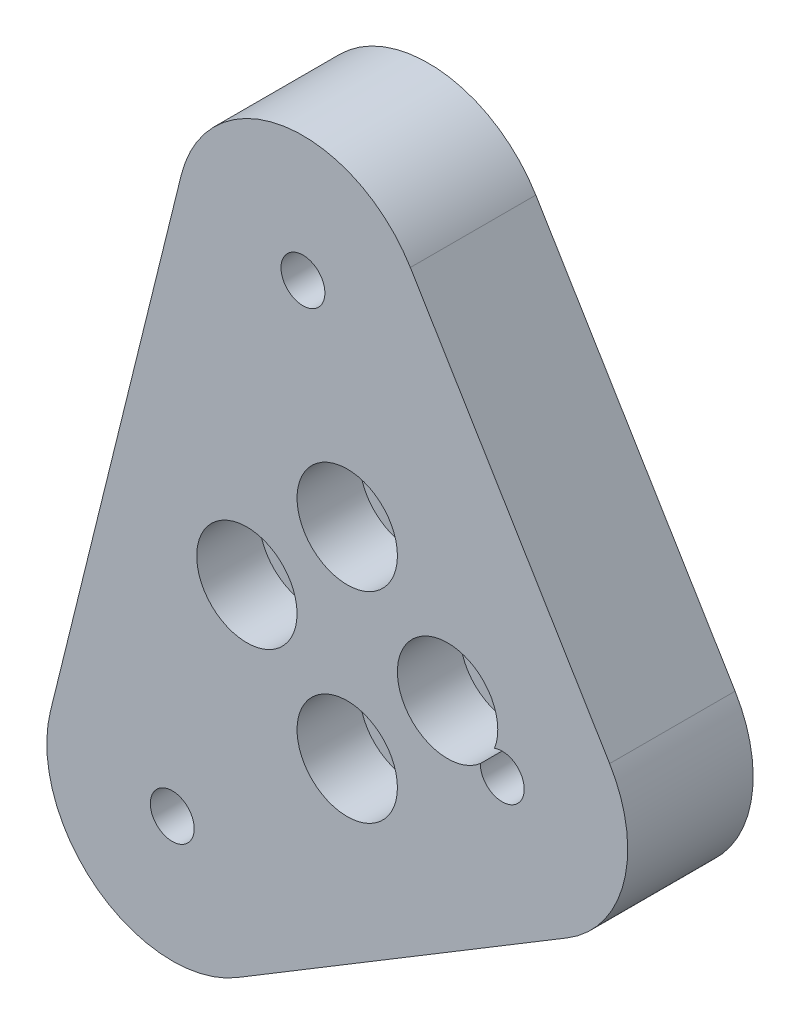
ISO-10303-21;
HEADER;
FILE_DESCRIPTION(('STEP AP214'),'2;1');
FILE_NAME('part.step','',(''),(''),'','','');
FILE_SCHEMA(('AUTOMOTIVE_DESIGN { 1 0 10303 214 1 1 1 1 }'));
ENDSEC;
DATA;
#1=APPLICATION_CONTEXT('core data for automotive mechanical design processes');
#2=APPLICATION_PROTOCOL_DEFINITION('international standard','automotive_design',2000,#1);
#3=PRODUCT_CONTEXT('',#1,'mechanical');
#4=PRODUCT('Part','Part','',(#3));
#5=PRODUCT_RELATED_PRODUCT_CATEGORY('part','',(#4));
#6=PRODUCT_DEFINITION_FORMATION('','',#4);
#7=PRODUCT_DEFINITION_CONTEXT('part definition',#1,'design');
#8=PRODUCT_DEFINITION('design','',#6,#7);
#9=PRODUCT_DEFINITION_SHAPE('','',#8);
#10=(LENGTH_UNIT() NAMED_UNIT(*) SI_UNIT(.MILLI.,.METRE.));
#11=(NAMED_UNIT(*) PLANE_ANGLE_UNIT() SI_UNIT($,.RADIAN.));
#12=(NAMED_UNIT(*) SI_UNIT($,.STERADIAN.) SOLID_ANGLE_UNIT());
#13=UNCERTAINTY_MEASURE_WITH_UNIT(LENGTH_MEASURE(1.E-05),#10,'distance_accuracy_value','');
#14=(GEOMETRIC_REPRESENTATION_CONTEXT(3) GLOBAL_UNCERTAINTY_ASSIGNED_CONTEXT((#13)) GLOBAL_UNIT_ASSIGNED_CONTEXT((#10,
#11,#12)) REPRESENTATION_CONTEXT('',''));
#15=CARTESIAN_POINT('',(0.,0.,0.));
#16=DIRECTION('',(0.,0.,1.));
#17=DIRECTION('',(1.,0.,0.));
#18=AXIS2_PLACEMENT_3D('',#15,#16,#17);
#19=CARTESIAN_POINT('',(-24.5681612260532,0.,5.));
#20=DIRECTION('',(0.,0.,1.));
#21=DIRECTION('',(1.,0.,0.));
#22=AXIS2_PLACEMENT_3D('',#19,#20,#21);
#23=PLANE('',#22);
#24=CARTESIAN_POINT('',(-8.,0.,5.));
#25=DIRECTION('',(0.,0.,1.));
#26=DIRECTION('',(1.,0.,0.));
#27=AXIS2_PLACEMENT_3D('',#24,#25,#26);
#28=CIRCLE('',#27,1.875);
#29=CARTESIAN_POINT('',(-9.875,0.,5.));
#30=VERTEX_POINT('',#29);
#31=EDGE_CURVE('E164',#30,#30,#28,.F.);
#32=ORIENTED_EDGE('',*,*,#31,.T.);
#33=EDGE_LOOP('',(#32));
#34=FACE_BOUND('',#33,.T.);
#35=CARTESIAN_POINT('',(-8.,0.,5.));
#36=DIRECTION('',(0.,0.,1.));
#37=DIRECTION('',(1.,0.,0.));
#38=AXIS2_PLACEMENT_3D('',#35,#36,#37);
#39=CIRCLE('',#38,4.);
#40=CARTESIAN_POINT('',(-4.,0.,5.));
#41=VERTEX_POINT('',#40);
#42=EDGE_CURVE('E214',#41,#41,#39,.F.);
#43=ORIENTED_EDGE('',*,*,#42,.F.);
#44=EDGE_LOOP('',(#43));
#45=FACE_BOUND('',#44,.T.);
#46=ADVANCED_FACE('F39',(#34,#45),#23,.T.);
#47=CARTESIAN_POINT('',(0.,8.,5.));
#48=DIRECTION('',(0.,0.,1.));
#49=DIRECTION('',(1.,0.,0.));
#50=AXIS2_PLACEMENT_3D('',#47,#48,#49);
#51=CIRCLE('',#50,1.875);
#52=CARTESIAN_POINT('',(-1.875,8.,5.));
#53=VERTEX_POINT('',#52);
#54=EDGE_CURVE('E159',#53,#53,#51,.F.);
#55=ORIENTED_EDGE('',*,*,#54,.T.);
#56=EDGE_LOOP('',(#55));
#57=FACE_BOUND('',#56,.T.);
#58=CARTESIAN_POINT('',(0.,8.,5.));
#59=DIRECTION('',(0.,0.,1.));
#60=DIRECTION('',(1.,0.,0.));
#61=AXIS2_PLACEMENT_3D('',#58,#59,#60);
#62=CIRCLE('',#61,4.);
#63=CARTESIAN_POINT('',(4.,8.,5.));
#64=VERTEX_POINT('',#63);
#65=EDGE_CURVE('E211',#64,#64,#62,.F.);
#66=ORIENTED_EDGE('',*,*,#65,.F.);
#67=EDGE_LOOP('',(#66));
#68=FACE_BOUND('',#67,.T.);
#69=ADVANCED_FACE('F289',(#57,#68),#23,.T.);
#70=CARTESIAN_POINT('',(12.3567981714621,-3.05115370798461,5.));
#71=DIRECTION('',(0.,0.,1.));
#72=DIRECTION('',(1.,0.,0.));
#73=AXIS2_PLACEMENT_3D('',#70,#71,#72);
#74=CIRCLE('',#73,1.75);
#75=CARTESIAN_POINT('',(11.7422659207362,-1.41260248424526,5.));
#76=VERTEX_POINT('',#75);
#77=CARTESIAN_POINT('',(10.6068838672656,-3.03383527940963,5.));
#78=VERTEX_POINT('',#77);
#79=EDGE_CURVE('E105',#76,#78,#74,.T.);
#80=ORIENTED_EDGE('',*,*,#79,.F.);
#81=CARTESIAN_POINT('',(7.99999999999989,-1.13196979001957E-13,5.));
#82=DIRECTION('',(0.,0.,1.));
#83=DIRECTION('',(1.,0.,0.));
#84=AXIS2_PLACEMENT_3D('',#81,#82,#83);
#85=CIRCLE('',#84,4.);
#86=EDGE_CURVE('E209',#78,#76,#85,.F.);
#87=ORIENTED_EDGE('',*,*,#86,.F.);
#88=EDGE_LOOP('',(#80,#87));
#89=FACE_BOUND('',#88,.T.);
#90=CARTESIAN_POINT('',(7.99999999999989,-1.13196979001957E-13,5.));
#91=DIRECTION('',(0.,0.,1.));
#92=DIRECTION('',(1.,0.,0.));
#93=AXIS2_PLACEMENT_3D('',#90,#91,#92);
#94=CIRCLE('',#93,1.87500000000022);
#95=CARTESIAN_POINT('',(6.12499999999967,-1.13196979001957E-13,5.));
#96=VERTEX_POINT('',#95);
#97=EDGE_CURVE('E153',#96,#96,#94,.F.);
#98=ORIENTED_EDGE('',*,*,#97,.T.);
#99=EDGE_LOOP('',(#98));
#100=FACE_BOUND('',#99,.T.);
#101=ADVANCED_FACE('F217',(#89,#100),#23,.T.);
#102=CARTESIAN_POINT('',(-2.24434523125278E-13,-8.,5.));
#103=DIRECTION('',(0.,0.,1.));
#104=DIRECTION('',(1.,0.,0.));
#105=AXIS2_PLACEMENT_3D('',#102,#103,#104);
#106=CIRCLE('',#105,1.87500000000027);
#107=CARTESIAN_POINT('',(-1.87500000000049,-8.,5.));
#108=VERTEX_POINT('',#107);
#109=EDGE_CURVE('E170',#108,#108,#106,.F.);
#110=ORIENTED_EDGE('',*,*,#109,.T.);
#111=EDGE_LOOP('',(#110));
#112=FACE_BOUND('',#111,.T.);
#113=CARTESIAN_POINT('',(-2.24434523125278E-13,-8.,5.));
#114=DIRECTION('',(0.,0.,1.));
#115=DIRECTION('',(1.,0.,0.));
#116=AXIS2_PLACEMENT_3D('',#113,#114,#115);
#117=CIRCLE('',#116,4.);
#118=CARTESIAN_POINT('',(3.99999999999978,-8.,5.));
#119=VERTEX_POINT('',#118);
#120=EDGE_CURVE('E206',#119,#119,#117,.F.);
#121=ORIENTED_EDGE('',*,*,#120,.F.);
#122=EDGE_LOOP('',(#121));
#123=FACE_BOUND('',#122,.T.);
#124=ADVANCED_FACE('F278',(#112,#123),#23,.T.);
#125=CARTESIAN_POINT('',(12.3567981714621,-3.05115370798461,70.));
#126=DIRECTION('',(0.,0.,-1.));
#127=DIRECTION('',(-1.,0.,0.));
#128=AXIS2_PLACEMENT_3D('',#125,#126,#127);
#129=CYLINDRICAL_SURFACE('',#128,10.);
#130=DIRECTION('',(0.,0.,-1.));
#131=VECTOR('',#130,1.);
#132=CARTESIAN_POINT('',(20.9167714378215,2.1186487717251,70.));
#133=LINE('',#132,#131);
#134=CARTESIAN_POINT('',(20.9167714378215,2.1186487717251,10.));
#135=VERTEX_POINT('',#134);
#136=CARTESIAN_POINT('',(20.9167714378215,2.1186487717251,0.));
#137=VERTEX_POINT('',#136);
#138=EDGE_CURVE('E200',#135,#137,#133,.T.);
#139=ORIENTED_EDGE('',*,*,#138,.F.);
#140=CARTESIAN_POINT('',(12.3567981714621,-3.05115370798461,10.));
#141=DIRECTION('',(0.,0.,1.));
#142=DIRECTION('',(1.,0.,0.));
#143=AXIS2_PLACEMENT_3D('',#140,#141,#142);
#144=CIRCLE('',#143,10.);
#145=CARTESIAN_POINT('',(17.526600651172,-11.6111269743439,10.));
#146=VERTEX_POINT('',#145);
#147=EDGE_CURVE('E137',#146,#135,#144,.T.);
#148=ORIENTED_EDGE('',*,*,#147,.F.);
#149=DIRECTION('',(0.,0.,-1.));
#150=VECTOR('',#149,1.);
#151=CARTESIAN_POINT('',(17.5266006511719,-11.6111269743439,70.));
#152=LINE('',#151,#150);
#153=CARTESIAN_POINT('',(17.5266006511719,-11.6111269743439,0.));
#154=VERTEX_POINT('',#153);
#155=EDGE_CURVE('E202',#146,#154,#152,.T.);
#156=ORIENTED_EDGE('',*,*,#155,.T.);
#157=CARTESIAN_POINT('',(12.3567981714621,-3.05115370798461,0.));
#158=DIRECTION('',(0.,0.,1.));
#159=DIRECTION('',(1.,0.,0.));
#160=AXIS2_PLACEMENT_3D('',#157,#158,#159);
#161=CIRCLE('',#160,10.);
#162=EDGE_CURVE('E184',#154,#137,#161,.T.);
#163=ORIENTED_EDGE('',*,*,#162,.T.);
#164=EDGE_LOOP('',(#139,#148,#156,#163));
#165=FACE_BOUND('',#164,.T.);
#166=ADVANCED_FACE('F276',(#165),#129,.T.);
#167=CARTESIAN_POINT('',(-23.6546385003536,-16.5396697222779,70.));
#168=DIRECTION('',(0.970841753421606,-0.239721275262046,0.));
#169=DIRECTION('',(0.239721275262046,0.970841753421606,0.));
#170=AXIS2_PLACEMENT_3D('',#167,#168,#169);
#171=PLANE('',#170);
#172=DIRECTION('',(0.,0.,-1.));
#173=VECTOR('',#172,1.);
#174=CARTESIAN_POINT('',(-23.6546385003536,-16.5396697222779,70.));
#175=LINE('',#174,#173);
#176=CARTESIAN_POINT('',(-23.6546385003536,-16.5396697222779,10.));
#177=VERTEX_POINT('',#176);
#178=CARTESIAN_POINT('',(-23.6546385003536,-16.5396697222779,0.));
#179=VERTEX_POINT('',#178);
#180=EDGE_CURVE('E61',#177,#179,#175,.T.);
#181=ORIENTED_EDGE('',*,*,#180,.F.);
#182=DIRECTION('',(-0.239721275262046,-0.970841753421606,0.));
#183=VECTOR('',#182,1.);
#184=CARTESIAN_POINT('',(-13.2373481296674,25.6490781822357,10.));
#185=LINE('',#184,#183);
#186=CARTESIAN_POINT('',(-13.2373481296674,25.6490781822357,10.));
#187=VERTEX_POINT('',#186);
#188=EDGE_CURVE('E146',#187,#177,#185,.T.);
#189=ORIENTED_EDGE('',*,*,#188,.F.);
#190=DIRECTION('',(0.,0.,-1.));
#191=VECTOR('',#190,1.);
#192=CARTESIAN_POINT('',(-13.2373481296674,25.6490781822357,70.));
#193=LINE('',#192,#191);
#194=CARTESIAN_POINT('',(-13.2373481296674,25.6490781822357,0.));
#195=VERTEX_POINT('',#194);
#196=EDGE_CURVE('E196',#187,#195,#193,.T.);
#197=ORIENTED_EDGE('',*,*,#196,.T.);
#198=DIRECTION('',(-0.239721275262046,-0.970841753421606,0.));
#199=VECTOR('',#198,1.);
#200=CARTESIAN_POINT('',(-23.6546385003536,-16.5396697222779,0.));
#201=LINE('',#200,#199);
#202=EDGE_CURVE('E193',#195,#179,#201,.T.);
#203=ORIENTED_EDGE('',*,*,#202,.T.);
#204=EDGE_LOOP('',(#181,#189,#197,#203));
#205=FACE_BOUND('',#204,.T.);
#206=ADVANCED_FACE('F239',(#205),#171,.F.);
#207=CARTESIAN_POINT('',(-13.9462209661375,-18.9368824748984,0.));
#208=DIRECTION('',(0.,0.,1.));
#209=DIRECTION('',(1.,0.,0.));
#210=AXIS2_PLACEMENT_3D('',#207,#208,#209);
#211=PLANE('',#210);
#212=CARTESIAN_POINT('',(-3.52893059545137,23.2518654296152,0.));
#213=DIRECTION('',(0.,0.,-1.));
#214=DIRECTION('',(-1.,0.,0.));
#215=AXIS2_PLACEMENT_3D('',#212,#213,#214);
#216=CIRCLE('',#215,1.75);
#217=CARTESIAN_POINT('',(-5.27893059545137,23.2518654296152,0.));
#218=VERTEX_POINT('',#217);
#219=EDGE_CURVE('E221',#218,#218,#216,.T.);
#220=ORIENTED_EDGE('',*,*,#219,.F.);
#221=EDGE_LOOP('',(#220));
#222=FACE_BOUND('',#221,.T.);
#223=CARTESIAN_POINT('',(12.3567981714621,-3.05115370798461,0.));
#224=DIRECTION('',(0.,0.,-1.));
#225=DIRECTION('',(-1.,0.,0.));
#226=AXIS2_PLACEMENT_3D('',#223,#224,#225);
#227=CIRCLE('',#226,1.75);
#228=CARTESIAN_POINT('',(10.6067981714621,-3.05115370798461,0.));
#229=VERTEX_POINT('',#228);
#230=EDGE_CURVE('E115',#229,#229,#227,.T.);
#231=ORIENTED_EDGE('',*,*,#230,.F.);
#232=EDGE_LOOP('',(#231));
#233=FACE_BOUND('',#232,.T.);
#234=CARTESIAN_POINT('',(-13.9462209661375,-18.9368824748984,0.));
#235=DIRECTION('',(0.,0.,-1.));
#236=DIRECTION('',(-1.,0.,0.));
#237=AXIS2_PLACEMENT_3D('',#234,#235,#236);
#238=CIRCLE('',#237,1.75);
#239=CARTESIAN_POINT('',(-15.6962209661375,-18.9368824748984,0.));
#240=VERTEX_POINT('',#239);
#241=EDGE_CURVE('E116',#240,#240,#238,.T.);
#242=ORIENTED_EDGE('',*,*,#241,.F.);
#243=EDGE_LOOP('',(#242));
#244=FACE_BOUND('',#243,.T.);
#245=CARTESIAN_POINT('',(0.,0.,0.));
#246=DIRECTION('',(0.,0.,-1.));
#247=DIRECTION('',(-1.,0.,0.));
#248=AXIS2_PLACEMENT_3D('',#245,#246,#247);
#249=CIRCLE('',#248,4.);
#250=CARTESIAN_POINT('',(-4.,0.,0.));
#251=VERTEX_POINT('',#250);
#252=EDGE_CURVE('E149',#251,#251,#249,.T.);
#253=ORIENTED_EDGE('',*,*,#252,.F.);
#254=EDGE_LOOP('',(#253));
#255=FACE_BOUND('',#254,.T.);
#256=CARTESIAN_POINT('',(0.,8.,0.));
#257=DIRECTION('',(0.,0.,-1.));
#258=DIRECTION('',(-1.,0.,0.));
#259=AXIS2_PLACEMENT_3D('',#256,#257,#258);
#260=CIRCLE('',#259,1.875);
#261=CARTESIAN_POINT('',(-1.875,8.,0.));
#262=VERTEX_POINT('',#261);
#263=EDGE_CURVE('E156',#262,#262,#260,.T.);
#264=ORIENTED_EDGE('',*,*,#263,.F.);
#265=EDGE_LOOP('',(#264));
#266=FACE_BOUND('',#265,.T.);
#267=CARTESIAN_POINT('',(-8.,0.,0.));
#268=DIRECTION('',(0.,0.,-1.));
#269=DIRECTION('',(-1.,0.,0.));
#270=AXIS2_PLACEMENT_3D('',#267,#268,#269);
#271=CIRCLE('',#270,1.875);
#272=CARTESIAN_POINT('',(-9.875,0.,0.));
#273=VERTEX_POINT('',#272);
#274=EDGE_CURVE('E160',#273,#273,#271,.T.);
#275=ORIENTED_EDGE('',*,*,#274,.F.);
#276=EDGE_LOOP('',(#275));
#277=FACE_BOUND('',#276,.T.);
#278=CARTESIAN_POINT('',(-2.24434523125278E-13,-8.,0.));
#279=DIRECTION('',(0.,0.,-1.));
#280=DIRECTION('',(-1.,0.,0.));
#281=AXIS2_PLACEMENT_3D('',#278,#279,#280);
#282=CIRCLE('',#281,1.87500000000027);
#283=CARTESIAN_POINT('',(-1.87500000000049,-8.,0.));
#284=VERTEX_POINT('',#283);
#285=EDGE_CURVE('E167',#284,#284,#282,.T.);
#286=ORIENTED_EDGE('',*,*,#285,.F.);
#287=EDGE_LOOP('',(#286));
#288=FACE_BOUND('',#287,.T.);
#289=CARTESIAN_POINT('',(7.99999999999989,-1.13196979001957E-13,0.));
#290=DIRECTION('',(0.,0.,-1.));
#291=DIRECTION('',(-1.,0.,0.));
#292=AXIS2_PLACEMENT_3D('',#289,#290,#291);
#293=CIRCLE('',#292,1.87500000000022);
#294=CARTESIAN_POINT('',(6.12499999999967,-1.13196979001957E-13,0.));
#295=VERTEX_POINT('',#294);
#296=EDGE_CURVE('E173',#295,#295,#293,.T.);
#297=ORIENTED_EDGE('',*,*,#296,.F.);
#298=EDGE_LOOP('',(#297));
#299=FACE_BOUND('',#298,.T.);
#300=CARTESIAN_POINT('',(-13.9462209661375,-18.9368824748984,0.));
#301=DIRECTION('',(0.,0.,1.));
#302=DIRECTION('',(1.,0.,0.));
#303=AXIS2_PLACEMENT_3D('',#300,#301,#302);
#304=CIRCLE('',#303,10.);
#305=CARTESIAN_POINT('',(-8.77641848642773,-27.4968557412577,0.));
#306=VERTEX_POINT('',#305);
#307=EDGE_CURVE('E163',#179,#306,#304,.T.);
#308=ORIENTED_EDGE('',*,*,#307,.F.);
#309=ORIENTED_EDGE('',*,*,#202,.F.);
#310=CARTESIAN_POINT('',(-3.52893059545137,23.2518654296152,0.));
#311=DIRECTION('',(0.,0.,1.));
#312=DIRECTION('',(1.,0.,0.));
#313=AXIS2_PLACEMENT_3D('',#310,#311,#312);
#314=CIRCLE('',#313,10.);
#315=CARTESIAN_POINT('',(5.03104267090801,28.4216679093249,0.));
#316=VERTEX_POINT('',#315);
#317=EDGE_CURVE('E190',#316,#195,#314,.T.);
#318=ORIENTED_EDGE('',*,*,#317,.F.);
#319=DIRECTION('',(-0.516980247970972,0.855997326635938,0.));
#320=VECTOR('',#319,1.);
#321=CARTESIAN_POINT('',(5.03104267090801,28.4216679093249,0.));
#322=LINE('',#321,#320);
#323=EDGE_CURVE('E187',#137,#316,#322,.T.);
#324=ORIENTED_EDGE('',*,*,#323,.F.);
#325=ORIENTED_EDGE('',*,*,#162,.F.);
#326=DIRECTION('',(0.855997326635932,0.516980247970981,0.));
#327=VECTOR('',#326,1.);
#328=CARTESIAN_POINT('',(17.526600651172,-11.6111269743439,0.));
#329=LINE('',#328,#327);
#330=EDGE_CURVE('E181',#306,#154,#329,.T.);
#331=ORIENTED_EDGE('',*,*,#330,.F.);
#332=EDGE_LOOP('',(#308,#309,#318,#324,#325,#331));
#333=FACE_BOUND('',#332,.T.);
#334=ADVANCED_FACE('F236',(#222,#233,#244,#255,#266,#277,#288,#299,#333),#211,.F.);
#335=CARTESIAN_POINT('',(-13.9462209661375,-18.9368824748984,70.));
#336=DIRECTION('',(0.,0.,-1.));
#337=DIRECTION('',(-1.,0.,0.));
#338=AXIS2_PLACEMENT_3D('',#335,#336,#337);
#339=CYLINDRICAL_SURFACE('',#338,10.);
#340=DIRECTION('',(0.,0.,-1.));
#341=VECTOR('',#340,1.);
#342=CARTESIAN_POINT('',(-8.77641848642773,-27.4968557412577,70.));
#343=LINE('',#342,#341);
#344=CARTESIAN_POINT('',(-8.77641848642773,-27.4968557412577,10.));
#345=VERTEX_POINT('',#344);
#346=EDGE_CURVE('E204',#345,#306,#343,.T.);
#347=ORIENTED_EDGE('',*,*,#346,.F.);
#348=CARTESIAN_POINT('',(-13.9462209661375,-18.9368824748984,10.));
#349=DIRECTION('',(0.,0.,1.));
#350=DIRECTION('',(1.,0.,0.));
#351=AXIS2_PLACEMENT_3D('',#348,#349,#350);
#352=CIRCLE('',#351,10.);
#353=EDGE_CURVE('E131',#177,#345,#352,.T.);
#354=ORIENTED_EDGE('',*,*,#353,.F.);
#355=ORIENTED_EDGE('',*,*,#180,.T.);
#356=ORIENTED_EDGE('',*,*,#307,.T.);
#357=EDGE_LOOP('',(#347,#354,#355,#356));
#358=FACE_BOUND('',#357,.T.);
#359=ADVANCED_FACE('F41',(#358),#339,.T.);
#360=CARTESIAN_POINT('',(17.526600651172,-11.6111269743439,70.));
#361=DIRECTION('',(-0.516980247970981,0.855997326635932,0.));
#362=DIRECTION('',(-0.855997326635932,-0.516980247970981,0.));
#363=AXIS2_PLACEMENT_3D('',#360,#361,#362);
#364=PLANE('',#363);
#365=ORIENTED_EDGE('',*,*,#155,.F.);
#366=DIRECTION('',(0.855997326635932,0.516980247970981,0.));
#367=VECTOR('',#366,1.);
#368=CARTESIAN_POINT('',(-8.77641848642773,-27.4968557412577,10.));
#369=LINE('',#368,#367);
#370=EDGE_CURVE('E134',#345,#146,#369,.T.);
#371=ORIENTED_EDGE('',*,*,#370,.F.);
#372=ORIENTED_EDGE('',*,*,#346,.T.);
#373=ORIENTED_EDGE('',*,*,#330,.T.);
#374=EDGE_LOOP('',(#365,#371,#372,#373));
#375=FACE_BOUND('',#374,.T.);
#376=ADVANCED_FACE('F262',(#375),#364,.F.);
#377=CARTESIAN_POINT('',(5.03104267090801,28.4216679093249,70.));
#378=DIRECTION('',(-0.855997326635938,-0.516980247970972,0.));
#379=DIRECTION('',(0.516980247970972,-0.855997326635938,0.));
#380=AXIS2_PLACEMENT_3D('',#377,#378,#379);
#381=PLANE('',#380);
#382=DIRECTION('',(0.,0.,-1.));
#383=VECTOR('',#382,1.);
#384=CARTESIAN_POINT('',(5.03104267090801,28.4216679093249,70.));
#385=LINE('',#384,#383);
#386=CARTESIAN_POINT('',(5.03104267090801,28.4216679093249,10.));
#387=VERTEX_POINT('',#386);
#388=EDGE_CURVE('E198',#387,#316,#385,.T.);
#389=ORIENTED_EDGE('',*,*,#388,.F.);
#390=DIRECTION('',(-0.516980247970972,0.855997326635938,0.));
#391=VECTOR('',#390,1.);
#392=CARTESIAN_POINT('',(20.9167714378215,2.1186487717251,10.));
#393=LINE('',#392,#391);
#394=EDGE_CURVE('E140',#135,#387,#393,.T.);
#395=ORIENTED_EDGE('',*,*,#394,.F.);
#396=ORIENTED_EDGE('',*,*,#138,.T.);
#397=ORIENTED_EDGE('',*,*,#323,.T.);
#398=EDGE_LOOP('',(#389,#395,#396,#397));
#399=FACE_BOUND('',#398,.T.);
#400=ADVANCED_FACE('F273',(#399),#381,.F.);
#401=CARTESIAN_POINT('',(-3.52893059545137,23.2518654296152,70.));
#402=DIRECTION('',(0.,0.,-1.));
#403=DIRECTION('',(-1.,0.,0.));
#404=AXIS2_PLACEMENT_3D('',#401,#402,#403);
#405=CYLINDRICAL_SURFACE('',#404,10.);
#406=ORIENTED_EDGE('',*,*,#196,.F.);
#407=CARTESIAN_POINT('',(-3.52893059545137,23.2518654296152,10.));
#408=DIRECTION('',(0.,0.,1.));
#409=DIRECTION('',(1.,0.,0.));
#410=AXIS2_PLACEMENT_3D('',#407,#408,#409);
#411=CIRCLE('',#410,10.);
#412=EDGE_CURVE('E143',#387,#187,#411,.T.);
#413=ORIENTED_EDGE('',*,*,#412,.F.);
#414=ORIENTED_EDGE('',*,*,#388,.T.);
#415=ORIENTED_EDGE('',*,*,#317,.T.);
#416=EDGE_LOOP('',(#406,#413,#414,#415));
#417=FACE_BOUND('',#416,.T.);
#418=ADVANCED_FACE('F270',(#417),#405,.T.);
#419=CARTESIAN_POINT('',(7.99999999999989,-1.13196979001957E-13,10.3033008588999));
#420=DIRECTION('',(0.,0.,-1.));
#421=DIRECTION('',(-1.,0.,0.));
#422=AXIS2_PLACEMENT_3D('',#419,#420,#421);
#423=CYLINDRICAL_SURFACE('',#422,1.87500000000022);
#424=CARTESIAN_POINT('',(6.12499999999967,-1.13196979001957E-13,0.));
#425=CARTESIAN_POINT('',(6.12499999999967,-1.13196979001957E-13,0.0520833333333334));
#426=CARTESIAN_POINT('',(6.12499999999967,-1.13196979001957E-13,0.104166666666667));
#427=CARTESIAN_POINT('',(6.12499999999967,-1.13196979001957E-13,0.208333333333334));
#428=CARTESIAN_POINT('',(6.12499999999967,-1.13196979001957E-13,0.260416666666667));
#429=CARTESIAN_POINT('',(6.12499999999967,-1.13196979001957E-13,0.364583333333334));
#430=CARTESIAN_POINT('',(6.12499999999967,-1.13196979001957E-13,0.416666666666667));
#431=CARTESIAN_POINT('',(6.12499999999967,-1.13196979001957E-13,0.520833333333334));
#432=CARTESIAN_POINT('',(6.12499999999967,-1.13196979001957E-13,0.572916666666667));
#433=CARTESIAN_POINT('',(6.12499999999967,-1.13196979001957E-13,0.677083333333334));
#434=CARTESIAN_POINT('',(6.12499999999967,-1.13196979001957E-13,0.729166666666667));
#435=CARTESIAN_POINT('',(6.12499999999967,-1.13196979001957E-13,0.833333333333333));
#436=CARTESIAN_POINT('',(6.12499999999967,-1.13196979001957E-13,0.885416666666666));
#437=CARTESIAN_POINT('',(6.12499999999967,-1.13196979001957E-13,0.989583333333333));
#438=CARTESIAN_POINT('',(6.12499999999967,-1.13196979001957E-13,1.04166666666667));
#439=CARTESIAN_POINT('',(6.12499999999967,-1.13196979001957E-13,1.14583333333333));
#440=CARTESIAN_POINT('',(6.12499999999967,-1.13196979001957E-13,1.19791666666667));
#441=CARTESIAN_POINT('',(6.12499999999967,-1.13196979001957E-13,1.30208333333333));
#442=CARTESIAN_POINT('',(6.12499999999967,-1.13196979001957E-13,1.35416666666667));
#443=CARTESIAN_POINT('',(6.12499999999967,-1.13196979001957E-13,1.45833333333333));
#444=CARTESIAN_POINT('',(6.12499999999967,-1.13196979001957E-13,1.51041666666667));
#445=CARTESIAN_POINT('',(6.12499999999967,-1.13196979001957E-13,1.61458333333333));
#446=CARTESIAN_POINT('',(6.12499999999967,-1.13196979001957E-13,1.66666666666667));
#447=CARTESIAN_POINT('',(6.12499999999967,-1.13196979001957E-13,1.77083333333333));
#448=CARTESIAN_POINT('',(6.12499999999967,-1.13196979001957E-13,1.82291666666667));
#449=CARTESIAN_POINT('',(6.12499999999967,-1.13196979001957E-13,1.92708333333333));
#450=CARTESIAN_POINT('',(6.12499999999967,-1.13196979001957E-13,1.97916666666667));
#451=CARTESIAN_POINT('',(6.12499999999967,-1.13196979001957E-13,2.08333333333333));
#452=CARTESIAN_POINT('',(6.12499999999967,-1.13196979001957E-13,2.13541666666667));
#453=CARTESIAN_POINT('',(6.12499999999967,-1.13196979001957E-13,2.23958333333333));
#454=CARTESIAN_POINT('',(6.12499999999967,-1.13196979001957E-13,2.29166666666667));
#455=CARTESIAN_POINT('',(6.12499999999967,-1.13196979001957E-13,2.39583333333333));
#456=CARTESIAN_POINT('',(6.12499999999967,-1.13196979001957E-13,2.44791666666667));
#457=CARTESIAN_POINT('',(6.12499999999967,-1.13196979001957E-13,2.55208333333333));
#458=CARTESIAN_POINT('',(6.12499999999967,-1.13196979001957E-13,2.60416666666667));
#459=CARTESIAN_POINT('',(6.12499999999967,-1.13196979001957E-13,2.70833333333333));
#460=CARTESIAN_POINT('',(6.12499999999967,-1.13196979001957E-13,2.76041666666666));
#461=CARTESIAN_POINT('',(6.12499999999967,-1.13196979001957E-13,2.86458333333333));
#462=CARTESIAN_POINT('',(6.12499999999967,-1.13196979001957E-13,2.91666666666667));
#463=CARTESIAN_POINT('',(6.12499999999967,-1.13196979001957E-13,3.02083333333333));
#464=CARTESIAN_POINT('',(6.12499999999967,-1.13196979001957E-13,3.07291666666667));
#465=CARTESIAN_POINT('',(6.12499999999967,-1.13196979001957E-13,3.17708333333333));
#466=CARTESIAN_POINT('',(6.12499999999967,-1.13196979001957E-13,3.22916666666667));
#467=CARTESIAN_POINT('',(6.12499999999967,-1.13196979001957E-13,3.33333333333333));
#468=CARTESIAN_POINT('',(6.12499999999967,-1.13196979001957E-13,3.38541666666667));
#469=CARTESIAN_POINT('',(6.12499999999967,-1.13196979001957E-13,3.48958333333333));
#470=CARTESIAN_POINT('',(6.12499999999967,-1.13196979001957E-13,3.54166666666667));
#471=CARTESIAN_POINT('',(6.12499999999967,-1.13196979001957E-13,3.64583333333333));
#472=CARTESIAN_POINT('',(6.12499999999967,-1.13196979001957E-13,3.69791666666667));
#473=CARTESIAN_POINT('',(6.12499999999967,-1.13196979001957E-13,3.80208333333333));
#474=CARTESIAN_POINT('',(6.12499999999967,-1.13196979001957E-13,3.85416666666667));
#475=CARTESIAN_POINT('',(6.12499999999967,-1.13196979001957E-13,3.95833333333333));
#476=CARTESIAN_POINT('',(6.12499999999967,-1.13196979001957E-13,4.01041666666667));
#477=CARTESIAN_POINT('',(6.12499999999967,-1.13196979001957E-13,4.11458333333333));
#478=CARTESIAN_POINT('',(6.12499999999967,-1.13196979001957E-13,4.16666666666667));
#479=CARTESIAN_POINT('',(6.12499999999967,-1.13196979001957E-13,4.27083333333333));
#480=CARTESIAN_POINT('',(6.12499999999967,-1.13196979001957E-13,4.32291666666667));
#481=CARTESIAN_POINT('',(6.12499999999967,-1.13196979001957E-13,4.42708333333333));
#482=CARTESIAN_POINT('',(6.12499999999967,-1.13196979001957E-13,4.47916666666667));
#483=CARTESIAN_POINT('',(6.12499999999967,-1.13196979001957E-13,4.58333333333333));
#484=CARTESIAN_POINT('',(6.12499999999967,-1.13196979001957E-13,4.63541666666667));
#485=CARTESIAN_POINT('',(6.12499999999967,-1.13196979001957E-13,4.73958333333333));
#486=CARTESIAN_POINT('',(6.12499999999967,-1.13196979001957E-13,4.79166666666666));
#487=CARTESIAN_POINT('',(6.12499999999967,-1.13196979001957E-13,4.89583333333333));
#488=CARTESIAN_POINT('',(6.12499999999967,-1.13196979001957E-13,4.94791666666666));
#489=CARTESIAN_POINT('',(6.12499999999967,-1.13196979001957E-13,5.));
#490=B_SPLINE_CURVE_WITH_KNOTS('',3,(#424,#425,#426,#427,#428,#429,#430,#431,#432,#433,#434,
#435,#436,#437,#438,#439,#440,#441,#442,#443,#444,#445,#446,#447,#448,#449,#450,#451,#452,#453,
#454,#455,#456,#457,#458,#459,#460,#461,#462,#463,#464,#465,#466,#467,#468,#469,#470,#471,#472,
#473,#474,#475,#476,#477,#478,#479,#480,#481,#482,#483,#484,#485,#486,#487,#488,#489),
.UNSPECIFIED.,.F.,.F.,(4,2,2,2,2,2,2,2,2,2,2,2,2,2,2,2,2,2,2,2,2,2,2,2,2,2,2,2,2,2,2,2,4),(0.,
0.15625,0.3125,0.46875,0.625000000000001,0.781250000000001,0.937499999999999,1.09375,1.25,
1.40625,1.5625,1.71875,1.875,2.03125,2.1875,2.34375,2.5,2.65625,2.8125,2.96875,3.125,3.28125,
3.4375,3.59375,3.75,3.90625,4.0625,4.21875,4.375,4.53125,4.6875,4.84375,5.),.UNSPECIFIED.);
#491=EDGE_CURVE('BSEAM297',#295,#96,#490,.T.);
#492=ORIENTED_EDGE('',*,*,#296,.T.);
#493=ORIENTED_EDGE('',*,*,#97,.F.);
#494=ORIENTED_EDGE('',*,*,#491,.T.);
#495=ORIENTED_EDGE('',*,*,#491,.F.);
#496=EDGE_LOOP('',(#492,#494,#493,#495));
#497=FACE_BOUND('',#496,.T.);
#498=ADVANCED_FACE('F297',(#497),#423,.F.);
#499=CARTESIAN_POINT('',(-2.24434523125278E-13,-8.,10.3033008588999));
#500=DIRECTION('',(0.,0.,-1.));
#501=DIRECTION('',(-1.,0.,0.));
#502=AXIS2_PLACEMENT_3D('',#499,#500,#501);
#503=CYLINDRICAL_SURFACE('',#502,1.87500000000027);
#504=CARTESIAN_POINT('',(-1.87500000000049,-8.,0.));
#505=CARTESIAN_POINT('',(-1.87500000000049,-8.,0.0520833333333334));
#506=CARTESIAN_POINT('',(-1.87500000000049,-8.,0.104166666666667));
#507=CARTESIAN_POINT('',(-1.87500000000049,-8.,0.208333333333334));
#508=CARTESIAN_POINT('',(-1.87500000000049,-8.,0.260416666666667));
#509=CARTESIAN_POINT('',(-1.87500000000049,-8.,0.364583333333334));
#510=CARTESIAN_POINT('',(-1.87500000000049,-8.,0.416666666666667));
#511=CARTESIAN_POINT('',(-1.87500000000049,-8.,0.520833333333334));
#512=CARTESIAN_POINT('',(-1.87500000000049,-8.,0.572916666666667));
#513=CARTESIAN_POINT('',(-1.87500000000049,-8.,0.677083333333334));
#514=CARTESIAN_POINT('',(-1.87500000000049,-8.,0.729166666666667));
#515=CARTESIAN_POINT('',(-1.87500000000049,-8.,0.833333333333334));
#516=CARTESIAN_POINT('',(-1.87500000000049,-8.,0.885416666666668));
#517=CARTESIAN_POINT('',(-1.87500000000049,-8.,0.989583333333334));
#518=CARTESIAN_POINT('',(-1.87500000000049,-8.,1.04166666666667));
#519=CARTESIAN_POINT('',(-1.87500000000049,-8.,1.14583333333333));
#520=CARTESIAN_POINT('',(-1.87500000000049,-8.,1.19791666666667));
#521=CARTESIAN_POINT('',(-1.87500000000049,-8.,1.30208333333333));
#522=CARTESIAN_POINT('',(-1.87500000000049,-8.,1.35416666666667));
#523=CARTESIAN_POINT('',(-1.87500000000049,-8.,1.45833333333333));
#524=CARTESIAN_POINT('',(-1.87500000000049,-8.,1.51041666666667));
#525=CARTESIAN_POINT('',(-1.87500000000049,-8.,1.61458333333333));
#526=CARTESIAN_POINT('',(-1.87500000000049,-8.,1.66666666666667));
#527=CARTESIAN_POINT('',(-1.87500000000049,-8.,1.77083333333333));
#528=CARTESIAN_POINT('',(-1.87500000000049,-8.,1.82291666666667));
#529=CARTESIAN_POINT('',(-1.87500000000049,-8.,1.92708333333333));
#530=CARTESIAN_POINT('',(-1.87500000000049,-8.,1.97916666666667));
#531=CARTESIAN_POINT('',(-1.87500000000049,-8.,2.08333333333333));
#532=CARTESIAN_POINT('',(-1.87500000000049,-8.,2.13541666666667));
#533=CARTESIAN_POINT('',(-1.87500000000049,-8.,2.23958333333333));
#534=CARTESIAN_POINT('',(-1.87500000000049,-8.,2.29166666666667));
#535=CARTESIAN_POINT('',(-1.87500000000049,-8.,2.39583333333333));
#536=CARTESIAN_POINT('',(-1.87500000000049,-8.,2.44791666666667));
#537=CARTESIAN_POINT('',(-1.87500000000049,-8.,2.55208333333333));
#538=CARTESIAN_POINT('',(-1.87500000000049,-8.,2.60416666666667));
#539=CARTESIAN_POINT('',(-1.87500000000049,-8.,2.70833333333333));
#540=CARTESIAN_POINT('',(-1.87500000000049,-8.,2.76041666666667));
#541=CARTESIAN_POINT('',(-1.87500000000049,-8.,2.86458333333333));
#542=CARTESIAN_POINT('',(-1.87500000000049,-8.,2.91666666666667));
#543=CARTESIAN_POINT('',(-1.87500000000049,-8.,3.02083333333333));
#544=CARTESIAN_POINT('',(-1.87500000000049,-8.,3.07291666666667));
#545=CARTESIAN_POINT('',(-1.87500000000049,-8.,3.17708333333333));
#546=CARTESIAN_POINT('',(-1.87500000000049,-8.,3.22916666666667));
#547=CARTESIAN_POINT('',(-1.87500000000049,-8.,3.33333333333333));
#548=CARTESIAN_POINT('',(-1.87500000000049,-8.,3.38541666666667));
#549=CARTESIAN_POINT('',(-1.87500000000049,-8.,3.48958333333333));
#550=CARTESIAN_POINT('',(-1.87500000000049,-8.,3.54166666666667));
#551=CARTESIAN_POINT('',(-1.87500000000049,-8.,3.64583333333333));
#552=CARTESIAN_POINT('',(-1.87500000000049,-8.,3.69791666666667));
#553=CARTESIAN_POINT('',(-1.87500000000049,-8.,3.80208333333333));
#554=CARTESIAN_POINT('',(-1.87500000000049,-8.,3.85416666666667));
#555=CARTESIAN_POINT('',(-1.87500000000049,-8.,3.95833333333333));
#556=CARTESIAN_POINT('',(-1.87500000000049,-8.,4.01041666666667));
#557=CARTESIAN_POINT('',(-1.87500000000049,-8.,4.11458333333333));
#558=CARTESIAN_POINT('',(-1.87500000000049,-8.,4.16666666666667));
#559=CARTESIAN_POINT('',(-1.87500000000049,-8.,4.27083333333333));
#560=CARTESIAN_POINT('',(-1.87500000000049,-8.,4.32291666666667));
#561=CARTESIAN_POINT('',(-1.87500000000049,-8.,4.42708333333333));
#562=CARTESIAN_POINT('',(-1.87500000000049,-8.,4.47916666666667));
#563=CARTESIAN_POINT('',(-1.87500000000049,-8.,4.58333333333333));
#564=CARTESIAN_POINT('',(-1.87500000000049,-8.,4.63541666666667));
#565=CARTESIAN_POINT('',(-1.87500000000049,-8.,4.73958333333333));
#566=CARTESIAN_POINT('',(-1.87500000000049,-8.,4.79166666666667));
#567=CARTESIAN_POINT('',(-1.87500000000049,-8.,4.89583333333333));
#568=CARTESIAN_POINT('',(-1.87500000000049,-8.,4.94791666666667));
#569=CARTESIAN_POINT('',(-1.87500000000049,-8.,5.));
#570=B_SPLINE_CURVE_WITH_KNOTS('',3,(#504,#505,#506,#507,#508,#509,#510,#511,#512,#513,#514,
#515,#516,#517,#518,#519,#520,#521,#522,#523,#524,#525,#526,#527,#528,#529,#530,#531,#532,#533,
#534,#535,#536,#537,#538,#539,#540,#541,#542,#543,#544,#545,#546,#547,#548,#549,#550,#551,#552,
#553,#554,#555,#556,#557,#558,#559,#560,#561,#562,#563,#564,#565,#566,#567,#568,#569),
.UNSPECIFIED.,.F.,.F.,(4,2,2,2,2,2,2,2,2,2,2,2,2,2,2,2,2,2,2,2,2,2,2,2,2,2,2,2,2,2,2,2,4),(0.,
0.15625,0.3125,0.46875,0.625000000000001,0.781250000000001,0.937500000000001,1.09375,1.25,
1.40625,1.5625,1.71875,1.875,2.03125,2.1875,2.34375,2.5,2.65625,2.8125,2.96875,3.125,3.28125,
3.4375,3.59375,3.75,3.90625,4.0625,4.21875,4.375,4.53125,4.6875,4.84375,5.),.UNSPECIFIED.);
#571=EDGE_CURVE('BSEAM395',#284,#108,#570,.T.);
#572=ORIENTED_EDGE('',*,*,#285,.T.);
#573=ORIENTED_EDGE('',*,*,#109,.F.);
#574=ORIENTED_EDGE('',*,*,#571,.T.);
#575=ORIENTED_EDGE('',*,*,#571,.F.);
#576=EDGE_LOOP('',(#572,#574,#573,#575));
#577=FACE_BOUND('',#576,.T.);
#578=ADVANCED_FACE('F395',(#577),#503,.F.);
#579=CARTESIAN_POINT('',(-8.,0.,10.3033008588999));
#580=DIRECTION('',(0.,0.,-1.));
#581=DIRECTION('',(-1.,0.,0.));
#582=AXIS2_PLACEMENT_3D('',#579,#580,#581);
#583=CYLINDRICAL_SURFACE('',#582,1.875);
#584=CARTESIAN_POINT('',(-9.875,0.,0.));
#585=CARTESIAN_POINT('',(-9.875,0.,0.0520833333333334));
#586=CARTESIAN_POINT('',(-9.875,0.,0.104166666666667));
#587=CARTESIAN_POINT('',(-9.875,0.,0.208333333333334));
#588=CARTESIAN_POINT('',(-9.875,0.,0.260416666666667));
#589=CARTESIAN_POINT('',(-9.875,0.,0.364583333333334));
#590=CARTESIAN_POINT('',(-9.875,0.,0.416666666666667));
#591=CARTESIAN_POINT('',(-9.875,0.,0.520833333333334));
#592=CARTESIAN_POINT('',(-9.875,0.,0.572916666666667));
#593=CARTESIAN_POINT('',(-9.875,0.,0.677083333333334));
#594=CARTESIAN_POINT('',(-9.875,0.,0.729166666666667));
#595=CARTESIAN_POINT('',(-9.875,0.,0.833333333333334));
#596=CARTESIAN_POINT('',(-9.875,0.,0.885416666666668));
#597=CARTESIAN_POINT('',(-9.875,0.,0.989583333333334));
#598=CARTESIAN_POINT('',(-9.875,0.,1.04166666666667));
#599=CARTESIAN_POINT('',(-9.875,0.,1.14583333333333));
#600=CARTESIAN_POINT('',(-9.875,0.,1.19791666666667));
#601=CARTESIAN_POINT('',(-9.875,0.,1.30208333333333));
#602=CARTESIAN_POINT('',(-9.875,0.,1.35416666666667));
#603=CARTESIAN_POINT('',(-9.875,0.,1.45833333333333));
#604=CARTESIAN_POINT('',(-9.875,0.,1.51041666666667));
#605=CARTESIAN_POINT('',(-9.875,0.,1.61458333333333));
#606=CARTESIAN_POINT('',(-9.875,0.,1.66666666666667));
#607=CARTESIAN_POINT('',(-9.875,0.,1.77083333333333));
#608=CARTESIAN_POINT('',(-9.875,0.,1.82291666666667));
#609=CARTESIAN_POINT('',(-9.875,0.,1.92708333333333));
#610=CARTESIAN_POINT('',(-9.875,0.,1.97916666666667));
#611=CARTESIAN_POINT('',(-9.875,0.,2.08333333333333));
#612=CARTESIAN_POINT('',(-9.875,0.,2.13541666666667));
#613=CARTESIAN_POINT('',(-9.875,0.,2.23958333333333));
#614=CARTESIAN_POINT('',(-9.875,0.,2.29166666666667));
#615=CARTESIAN_POINT('',(-9.875,0.,2.39583333333333));
#616=CARTESIAN_POINT('',(-9.875,0.,2.44791666666667));
#617=CARTESIAN_POINT('',(-9.875,0.,2.55208333333333));
#618=CARTESIAN_POINT('',(-9.875,0.,2.60416666666667));
#619=CARTESIAN_POINT('',(-9.875,0.,2.70833333333333));
#620=CARTESIAN_POINT('',(-9.875,0.,2.76041666666667));
#621=CARTESIAN_POINT('',(-9.875,0.,2.86458333333333));
#622=CARTESIAN_POINT('',(-9.875,0.,2.91666666666667));
#623=CARTESIAN_POINT('',(-9.875,0.,3.02083333333333));
#624=CARTESIAN_POINT('',(-9.875,0.,3.07291666666667));
#625=CARTESIAN_POINT('',(-9.875,0.,3.17708333333333));
#626=CARTESIAN_POINT('',(-9.875,0.,3.22916666666667));
#627=CARTESIAN_POINT('',(-9.875,0.,3.33333333333333));
#628=CARTESIAN_POINT('',(-9.875,0.,3.38541666666667));
#629=CARTESIAN_POINT('',(-9.875,0.,3.48958333333333));
#630=CARTESIAN_POINT('',(-9.875,0.,3.54166666666667));
#631=CARTESIAN_POINT('',(-9.875,0.,3.64583333333333));
#632=CARTESIAN_POINT('',(-9.875,0.,3.69791666666667));
#633=CARTESIAN_POINT('',(-9.875,0.,3.80208333333333));
#634=CARTESIAN_POINT('',(-9.875,0.,3.85416666666667));
#635=CARTESIAN_POINT('',(-9.875,0.,3.95833333333333));
#636=CARTESIAN_POINT('',(-9.875,0.,4.01041666666667));
#637=CARTESIAN_POINT('',(-9.875,0.,4.11458333333333));
#638=CARTESIAN_POINT('',(-9.875,0.,4.16666666666667));
#639=CARTESIAN_POINT('',(-9.875,0.,4.27083333333333));
#640=CARTESIAN_POINT('',(-9.875,0.,4.32291666666667));
#641=CARTESIAN_POINT('',(-9.875,0.,4.42708333333333));
#642=CARTESIAN_POINT('',(-9.875,0.,4.47916666666667));
#643=CARTESIAN_POINT('',(-9.875,0.,4.58333333333333));
#644=CARTESIAN_POINT('',(-9.875,0.,4.63541666666667));
#645=CARTESIAN_POINT('',(-9.875,0.,4.73958333333333));
#646=CARTESIAN_POINT('',(-9.875,0.,4.79166666666667));
#647=CARTESIAN_POINT('',(-9.875,0.,4.89583333333333));
#648=CARTESIAN_POINT('',(-9.875,0.,4.94791666666667));
#649=CARTESIAN_POINT('',(-9.875,0.,5.));
#650=B_SPLINE_CURVE_WITH_KNOTS('',3,(#584,#585,#586,#587,#588,#589,#590,#591,#592,#593,#594,
#595,#596,#597,#598,#599,#600,#601,#602,#603,#604,#605,#606,#607,#608,#609,#610,#611,#612,#613,
#614,#615,#616,#617,#618,#619,#620,#621,#622,#623,#624,#625,#626,#627,#628,#629,#630,#631,#632,
#633,#634,#635,#636,#637,#638,#639,#640,#641,#642,#643,#644,#645,#646,#647,#648,#649),
.UNSPECIFIED.,.F.,.F.,(4,2,2,2,2,2,2,2,2,2,2,2,2,2,2,2,2,2,2,2,2,2,2,2,2,2,2,2,2,2,2,2,4),(0.,
0.15625,0.3125,0.46875,0.625000000000001,0.781250000000001,0.937500000000001,1.09375,1.25,
1.40625,1.5625,1.71875,1.875,2.03125,2.1875,2.34375,2.5,2.65625,2.8125,2.96875,3.125,3.28125,
3.4375,3.59375,3.75,3.90625,4.0625,4.21875,4.375,4.53125,4.6875,4.84375,5.),.UNSPECIFIED.);
#651=EDGE_CURVE('BSEAM384',#273,#30,#650,.T.);
#652=ORIENTED_EDGE('',*,*,#274,.T.);
#653=ORIENTED_EDGE('',*,*,#31,.F.);
#654=ORIENTED_EDGE('',*,*,#651,.T.);
#655=ORIENTED_EDGE('',*,*,#651,.F.);
#656=EDGE_LOOP('',(#652,#654,#653,#655));
#657=FACE_BOUND('',#656,.T.);
#658=ADVANCED_FACE('F384',(#657),#583,.F.);
#659=CARTESIAN_POINT('',(0.,8.,10.3033008588999));
#660=DIRECTION('',(0.,0.,-1.));
#661=DIRECTION('',(-1.,0.,0.));
#662=AXIS2_PLACEMENT_3D('',#659,#660,#661);
#663=CYLINDRICAL_SURFACE('',#662,1.875);
#664=CARTESIAN_POINT('',(-1.875,8.,0.));
#665=CARTESIAN_POINT('',(-1.875,8.,0.0520833333333334));
#666=CARTESIAN_POINT('',(-1.875,8.,0.104166666666667));
#667=CARTESIAN_POINT('',(-1.875,8.,0.208333333333334));
#668=CARTESIAN_POINT('',(-1.875,8.,0.260416666666667));
#669=CARTESIAN_POINT('',(-1.875,8.,0.364583333333334));
#670=CARTESIAN_POINT('',(-1.875,8.,0.416666666666667));
#671=CARTESIAN_POINT('',(-1.875,8.,0.520833333333334));
#672=CARTESIAN_POINT('',(-1.875,8.,0.572916666666667));
#673=CARTESIAN_POINT('',(-1.875,8.,0.677083333333334));
#674=CARTESIAN_POINT('',(-1.875,8.,0.729166666666667));
#675=CARTESIAN_POINT('',(-1.875,8.,0.833333333333334));
#676=CARTESIAN_POINT('',(-1.875,8.,0.885416666666668));
#677=CARTESIAN_POINT('',(-1.875,8.,0.989583333333334));
#678=CARTESIAN_POINT('',(-1.875,8.,1.04166666666667));
#679=CARTESIAN_POINT('',(-1.875,8.,1.14583333333333));
#680=CARTESIAN_POINT('',(-1.875,8.,1.19791666666667));
#681=CARTESIAN_POINT('',(-1.875,8.,1.30208333333333));
#682=CARTESIAN_POINT('',(-1.875,8.,1.35416666666667));
#683=CARTESIAN_POINT('',(-1.875,8.,1.45833333333333));
#684=CARTESIAN_POINT('',(-1.875,8.,1.51041666666667));
#685=CARTESIAN_POINT('',(-1.875,8.,1.61458333333333));
#686=CARTESIAN_POINT('',(-1.875,8.,1.66666666666667));
#687=CARTESIAN_POINT('',(-1.875,8.,1.77083333333333));
#688=CARTESIAN_POINT('',(-1.875,8.,1.82291666666667));
#689=CARTESIAN_POINT('',(-1.875,8.,1.92708333333333));
#690=CARTESIAN_POINT('',(-1.875,8.,1.97916666666667));
#691=CARTESIAN_POINT('',(-1.875,8.,2.08333333333333));
#692=CARTESIAN_POINT('',(-1.875,8.,2.13541666666667));
#693=CARTESIAN_POINT('',(-1.875,8.,2.23958333333333));
#694=CARTESIAN_POINT('',(-1.875,8.,2.29166666666667));
#695=CARTESIAN_POINT('',(-1.875,8.,2.39583333333333));
#696=CARTESIAN_POINT('',(-1.875,8.,2.44791666666667));
#697=CARTESIAN_POINT('',(-1.875,8.,2.55208333333333));
#698=CARTESIAN_POINT('',(-1.875,8.,2.60416666666667));
#699=CARTESIAN_POINT('',(-1.875,8.,2.70833333333333));
#700=CARTESIAN_POINT('',(-1.875,8.,2.76041666666667));
#701=CARTESIAN_POINT('',(-1.875,8.,2.86458333333333));
#702=CARTESIAN_POINT('',(-1.875,8.,2.91666666666667));
#703=CARTESIAN_POINT('',(-1.875,8.,3.02083333333333));
#704=CARTESIAN_POINT('',(-1.875,8.,3.07291666666667));
#705=CARTESIAN_POINT('',(-1.875,8.,3.17708333333333));
#706=CARTESIAN_POINT('',(-1.875,8.,3.22916666666667));
#707=CARTESIAN_POINT('',(-1.875,8.,3.33333333333333));
#708=CARTESIAN_POINT('',(-1.875,8.,3.38541666666667));
#709=CARTESIAN_POINT('',(-1.875,8.,3.48958333333333));
#710=CARTESIAN_POINT('',(-1.875,8.,3.54166666666667));
#711=CARTESIAN_POINT('',(-1.875,8.,3.64583333333333));
#712=CARTESIAN_POINT('',(-1.875,8.,3.69791666666667));
#713=CARTESIAN_POINT('',(-1.875,8.,3.80208333333333));
#714=CARTESIAN_POINT('',(-1.875,8.,3.85416666666667));
#715=CARTESIAN_POINT('',(-1.875,8.,3.95833333333333));
#716=CARTESIAN_POINT('',(-1.875,8.,4.01041666666667));
#717=CARTESIAN_POINT('',(-1.875,8.,4.11458333333333));
#718=CARTESIAN_POINT('',(-1.875,8.,4.16666666666667));
#719=CARTESIAN_POINT('',(-1.875,8.,4.27083333333333));
#720=CARTESIAN_POINT('',(-1.875,8.,4.32291666666667));
#721=CARTESIAN_POINT('',(-1.875,8.,4.42708333333333));
#722=CARTESIAN_POINT('',(-1.875,8.,4.47916666666667));
#723=CARTESIAN_POINT('',(-1.875,8.,4.58333333333333));
#724=CARTESIAN_POINT('',(-1.875,8.,4.63541666666667));
#725=CARTESIAN_POINT('',(-1.875,8.,4.73958333333333));
#726=CARTESIAN_POINT('',(-1.875,8.,4.79166666666667));
#727=CARTESIAN_POINT('',(-1.875,8.,4.89583333333333));
#728=CARTESIAN_POINT('',(-1.875,8.,4.94791666666667));
#729=CARTESIAN_POINT('',(-1.875,8.,5.));
#730=B_SPLINE_CURVE_WITH_KNOTS('',3,(#664,#665,#666,#667,#668,#669,#670,#671,#672,#673,#674,
#675,#676,#677,#678,#679,#680,#681,#682,#683,#684,#685,#686,#687,#688,#689,#690,#691,#692,#693,
#694,#695,#696,#697,#698,#699,#700,#701,#702,#703,#704,#705,#706,#707,#708,#709,#710,#711,#712,
#713,#714,#715,#716,#717,#718,#719,#720,#721,#722,#723,#724,#725,#726,#727,#728,#729),
.UNSPECIFIED.,.F.,.F.,(4,2,2,2,2,2,2,2,2,2,2,2,2,2,2,2,2,2,2,2,2,2,2,2,2,2,2,2,2,2,2,2,4),(0.,
0.15625,0.3125,0.46875,0.625000000000001,0.781250000000001,0.937500000000001,1.09375,1.25,
1.40625,1.5625,1.71875,1.875,2.03125,2.1875,2.34375,2.5,2.65625,2.8125,2.96875,3.125,3.28125,
3.4375,3.59375,3.75,3.90625,4.0625,4.21875,4.375,4.53125,4.6875,4.84375,5.),.UNSPECIFIED.);
#731=EDGE_CURVE('BSEAM373',#262,#53,#730,.T.);
#732=ORIENTED_EDGE('',*,*,#263,.T.);
#733=ORIENTED_EDGE('',*,*,#54,.F.);
#734=ORIENTED_EDGE('',*,*,#731,.T.);
#735=ORIENTED_EDGE('',*,*,#731,.F.);
#736=EDGE_LOOP('',(#732,#734,#733,#735));
#737=FACE_BOUND('',#736,.T.);
#738=ADVANCED_FACE('F373',(#737),#663,.F.);
#739=CARTESIAN_POINT('',(0.,0.,3.));
#740=DIRECTION('',(0.,0.,-1.));
#741=DIRECTION('',(-1.,0.,0.));
#742=AXIS2_PLACEMENT_3D('',#739,#740,#741);
#743=CYLINDRICAL_SURFACE('',#742,4.);
#744=CARTESIAN_POINT('',(0.,0.,3.));
#745=DIRECTION('',(0.,0.,-1.));
#746=DIRECTION('',(-1.,0.,0.));
#747=AXIS2_PLACEMENT_3D('',#744,#745,#746);
#748=CIRCLE('',#747,4.);
#749=CARTESIAN_POINT('',(-4.,0.,3.));
#750=VERTEX_POINT('',#749);
#751=EDGE_CURVE('E150',#750,#750,#748,.T.);
#752=ORIENTED_EDGE('',*,*,#751,.F.);
#753=EDGE_LOOP('',(#752));
#754=FACE_BOUND('',#753,.T.);
#755=ORIENTED_EDGE('',*,*,#252,.T.);
#756=EDGE_LOOP('',(#755));
#757=FACE_BOUND('',#756,.T.);
#758=ADVANCED_FACE('F361',(#754,#757),#743,.F.);
#759=CARTESIAN_POINT('',(0.,0.,3.));
#760=DIRECTION('',(0.,0.,-1.));
#761=DIRECTION('',(-1.,0.,0.));
#762=AXIS2_PLACEMENT_3D('',#759,#760,#761);
#763=PLANE('',#762);
#764=ORIENTED_EDGE('',*,*,#751,.T.);
#765=EDGE_LOOP('',(#764));
#766=FACE_BOUND('',#765,.T.);
#767=ADVANCED_FACE('F356',(#766),#763,.T.);
#768=CARTESIAN_POINT('',(-13.9462209661375,-18.9368824748984,10.));
#769=DIRECTION('',(0.,0.,1.));
#770=DIRECTION('',(1.,0.,0.));
#771=AXIS2_PLACEMENT_3D('',#768,#769,#770);
#772=PLANE('',#771);
#773=CARTESIAN_POINT('',(-3.52893059545137,23.2518654296152,10.));
#774=DIRECTION('',(0.,0.,-1.));
#775=DIRECTION('',(-1.,0.,0.));
#776=AXIS2_PLACEMENT_3D('',#773,#774,#775);
#777=CIRCLE('',#776,1.75);
#778=CARTESIAN_POINT('',(-5.27893059545137,23.2518654296152,10.));
#779=VERTEX_POINT('',#778);
#780=EDGE_CURVE('E219',#779,#779,#777,.T.);
#781=ORIENTED_EDGE('',*,*,#780,.T.);
#782=EDGE_LOOP('',(#781));
#783=FACE_BOUND('',#782,.T.);
#784=CARTESIAN_POINT('',(12.3567981714621,-3.05115370798461,10.));
#785=DIRECTION('',(0.,0.,-1.));
#786=DIRECTION('',(-1.,0.,0.));
#787=AXIS2_PLACEMENT_3D('',#784,#785,#786);
#788=CIRCLE('',#787,1.75);
#789=CARTESIAN_POINT('',(11.7422659207362,-1.41260248424526,10.));
#790=VERTEX_POINT('',#789);
#791=CARTESIAN_POINT('',(10.6068838672656,-3.03383527940963,10.));
#792=VERTEX_POINT('',#791);
#793=EDGE_CURVE('E53',#790,#792,#788,.T.);
#794=ORIENTED_EDGE('',*,*,#793,.T.);
#795=CARTESIAN_POINT('',(7.99999999999989,-1.13196979001957E-13,10.));
#796=DIRECTION('',(0.,0.,1.));
#797=DIRECTION('',(1.,0.,0.));
#798=AXIS2_PLACEMENT_3D('',#795,#796,#797);
#799=CIRCLE('',#798,4.);
#800=EDGE_CURVE('E114',#790,#792,#799,.T.);
#801=ORIENTED_EDGE('',*,*,#800,.F.);
#802=EDGE_LOOP('',(#794,#801));
#803=FACE_BOUND('',#802,.T.);
#804=CARTESIAN_POINT('',(-13.9462209661375,-18.9368824748984,10.));
#805=DIRECTION('',(0.,0.,-1.));
#806=DIRECTION('',(-1.,0.,0.));
#807=AXIS2_PLACEMENT_3D('',#804,#805,#806);
#808=CIRCLE('',#807,1.75);
#809=CARTESIAN_POINT('',(-15.6962209661375,-18.9368824748984,10.));
#810=VERTEX_POINT('',#809);
#811=EDGE_CURVE('E224',#810,#810,#808,.T.);
#812=ORIENTED_EDGE('',*,*,#811,.T.);
#813=EDGE_LOOP('',(#812));
#814=FACE_BOUND('',#813,.T.);
#815=CARTESIAN_POINT('',(-8.,0.,10.));
#816=DIRECTION('',(0.,0.,1.));
#817=DIRECTION('',(1.,0.,0.));
#818=AXIS2_PLACEMENT_3D('',#815,#816,#817);
#819=CIRCLE('',#818,4.);
#820=CARTESIAN_POINT('',(-4.,0.,10.));
#821=VERTEX_POINT('',#820);
#822=EDGE_CURVE('E123',#821,#821,#819,.T.);
#823=ORIENTED_EDGE('',*,*,#822,.F.);
#824=EDGE_LOOP('',(#823));
#825=FACE_BOUND('',#824,.T.);
#826=ORIENTED_EDGE('',*,*,#353,.T.);
#827=ORIENTED_EDGE('',*,*,#370,.T.);
#828=ORIENTED_EDGE('',*,*,#147,.T.);
#829=ORIENTED_EDGE('',*,*,#394,.T.);
#830=ORIENTED_EDGE('',*,*,#412,.T.);
#831=ORIENTED_EDGE('',*,*,#188,.T.);
#832=EDGE_LOOP('',(#826,#827,#828,#829,#830,#831));
#833=FACE_BOUND('',#832,.T.);
#834=CARTESIAN_POINT('',(0.,8.,10.));
#835=DIRECTION('',(0.,0.,1.));
#836=DIRECTION('',(1.,0.,0.));
#837=AXIS2_PLACEMENT_3D('',#834,#835,#836);
#838=CIRCLE('',#837,4.);
#839=CARTESIAN_POINT('',(4.,8.,10.));
#840=VERTEX_POINT('',#839);
#841=EDGE_CURVE('E119',#840,#840,#838,.T.);
#842=ORIENTED_EDGE('',*,*,#841,.F.);
#843=EDGE_LOOP('',(#842));
#844=FACE_BOUND('',#843,.T.);
#845=CARTESIAN_POINT('',(-2.24434523125278E-13,-8.,10.));
#846=DIRECTION('',(0.,0.,1.));
#847=DIRECTION('',(1.,0.,0.));
#848=AXIS2_PLACEMENT_3D('',#845,#846,#847);
#849=CIRCLE('',#848,4.);
#850=CARTESIAN_POINT('',(3.99999999999978,-8.,10.));
#851=VERTEX_POINT('',#850);
#852=EDGE_CURVE('E120',#851,#851,#849,.T.);
#853=ORIENTED_EDGE('',*,*,#852,.F.);
#854=EDGE_LOOP('',(#853));
#855=FACE_BOUND('',#854,.T.);
#856=ADVANCED_FACE('F112',(#783,#803,#814,#825,#833,#844,#855),#772,.T.);
#857=CARTESIAN_POINT('',(-8.,0.,10.));
#858=DIRECTION('',(0.,0.,-1.));
#859=DIRECTION('',(-1.,0.,0.));
#860=AXIS2_PLACEMENT_3D('',#857,#858,#859);
#861=CYLINDRICAL_SURFACE('',#860,4.);
#862=ORIENTED_EDGE('',*,*,#822,.T.);
#863=EDGE_LOOP('',(#862));
#864=FACE_BOUND('',#863,.T.);
#865=ORIENTED_EDGE('',*,*,#42,.T.);
#866=EDGE_LOOP('',(#865));
#867=FACE_BOUND('',#866,.T.);
#868=ADVANCED_FACE('F429',(#864,#867),#861,.F.);
#869=CARTESIAN_POINT('',(0.,8.,10.));
#870=DIRECTION('',(0.,0.,-1.));
#871=DIRECTION('',(-1.,0.,0.));
#872=AXIS2_PLACEMENT_3D('',#869,#870,#871);
#873=CYLINDRICAL_SURFACE('',#872,4.);
#874=ORIENTED_EDGE('',*,*,#841,.T.);
#875=EDGE_LOOP('',(#874));
#876=FACE_BOUND('',#875,.T.);
#877=ORIENTED_EDGE('',*,*,#65,.T.);
#878=EDGE_LOOP('',(#877));
#879=FACE_BOUND('',#878,.T.);
#880=ADVANCED_FACE('F434',(#876,#879),#873,.F.);
#881=CARTESIAN_POINT('',(7.99999999999989,-1.13196979001957E-13,10.));
#882=DIRECTION('',(0.,0.,-1.));
#883=DIRECTION('',(-1.,0.,0.));
#884=AXIS2_PLACEMENT_3D('',#881,#882,#883);
#885=CYLINDRICAL_SURFACE('',#884,4.);
#886=DIRECTION('',(0.,0.,-1.));
#887=VECTOR('',#886,1.);
#888=CARTESIAN_POINT('',(10.6068838672656,-3.03383527940963,5.));
#889=LINE('',#888,#887);
#890=EDGE_CURVE('E11',#78,#792,#889,.F.);
#891=ORIENTED_EDGE('',*,*,#890,.F.);
#892=ORIENTED_EDGE('',*,*,#86,.T.);
#893=DIRECTION('',(0.,0.,-1.));
#894=VECTOR('',#893,1.);
#895=CARTESIAN_POINT('',(11.7422659207362,-1.41260248424526,5.));
#896=LINE('',#895,#894);
#897=EDGE_CURVE('E47',#790,#76,#896,.T.);
#898=ORIENTED_EDGE('',*,*,#897,.F.);
#899=ORIENTED_EDGE('',*,*,#800,.T.);
#900=EDGE_LOOP('',(#891,#892,#898,#899));
#901=FACE_BOUND('',#900,.T.);
#902=ADVANCED_FACE('F118',(#901),#885,.F.);
#903=CARTESIAN_POINT('',(-2.24434523125278E-13,-8.,10.));
#904=DIRECTION('',(0.,0.,-1.));
#905=DIRECTION('',(-1.,0.,0.));
#906=AXIS2_PLACEMENT_3D('',#903,#904,#905);
#907=CYLINDRICAL_SURFACE('',#906,4.);
#908=ORIENTED_EDGE('',*,*,#852,.T.);
#909=EDGE_LOOP('',(#908));
#910=FACE_BOUND('',#909,.T.);
#911=ORIENTED_EDGE('',*,*,#120,.T.);
#912=EDGE_LOOP('',(#911));
#913=FACE_BOUND('',#912,.T.);
#914=ADVANCED_FACE('F453',(#910,#913),#907,.F.);
#915=CARTESIAN_POINT('',(12.3567981714621,-3.05115370798461,10.));
#916=DIRECTION('',(0.,0.,-1.));
#917=DIRECTION('',(-1.,0.,0.));
#918=AXIS2_PLACEMENT_3D('',#915,#916,#917);
#919=CYLINDRICAL_SURFACE('',#918,1.75);
#920=ORIENTED_EDGE('',*,*,#890,.T.);
#921=ORIENTED_EDGE('',*,*,#793,.F.);
#922=ORIENTED_EDGE('',*,*,#897,.T.);
#923=ORIENTED_EDGE('',*,*,#79,.T.);
#924=EDGE_LOOP('',(#920,#921,#922,#923));
#925=FACE_BOUND('',#924,.T.);
#926=ORIENTED_EDGE('',*,*,#230,.T.);
#927=EDGE_LOOP('',(#926));
#928=FACE_BOUND('',#927,.T.);
#929=ADVANCED_FACE('F102',(#925,#928),#919,.F.);
#930=CARTESIAN_POINT('',(-13.9462209661375,-18.9368824748984,10.));
#931=DIRECTION('',(0.,0.,-1.));
#932=DIRECTION('',(-1.,0.,0.));
#933=AXIS2_PLACEMENT_3D('',#930,#931,#932);
#934=CYLINDRICAL_SURFACE('',#933,1.75);
#935=ORIENTED_EDGE('',*,*,#811,.F.);
#936=EDGE_LOOP('',(#935));
#937=FACE_BOUND('',#936,.T.);
#938=ORIENTED_EDGE('',*,*,#241,.T.);
#939=EDGE_LOOP('',(#938));
#940=FACE_BOUND('',#939,.T.);
#941=ADVANCED_FACE('F505',(#937,#940),#934,.F.);
#942=CARTESIAN_POINT('',(-3.52893059545137,23.2518654296152,10.));
#943=DIRECTION('',(0.,0.,-1.));
#944=DIRECTION('',(-1.,0.,0.));
#945=AXIS2_PLACEMENT_3D('',#942,#943,#944);
#946=CYLINDRICAL_SURFACE('',#945,1.75);
#947=ORIENTED_EDGE('',*,*,#780,.F.);
#948=EDGE_LOOP('',(#947));
#949=FACE_BOUND('',#948,.T.);
#950=ORIENTED_EDGE('',*,*,#219,.T.);
#951=EDGE_LOOP('',(#950));
#952=FACE_BOUND('',#951,.T.);
#953=ADVANCED_FACE('F234',(#949,#952),#946,.F.);
#954=CLOSED_SHELL('',(#46,#69,#101,#124,#166,#206,#334,#359,#376,#400,#418,#498,#578,#658,#738,
#758,#767,#856,#868,#880,#902,#914,#929,#941,#953));
#955=MANIFOLD_SOLID_BREP('B2',#954);
#956=ADVANCED_BREP_SHAPE_REPRESENTATION('',(#18,#955),#14);
#957=SHAPE_DEFINITION_REPRESENTATION(#9,#956);
ENDSEC;
END-ISO-10303-21;
